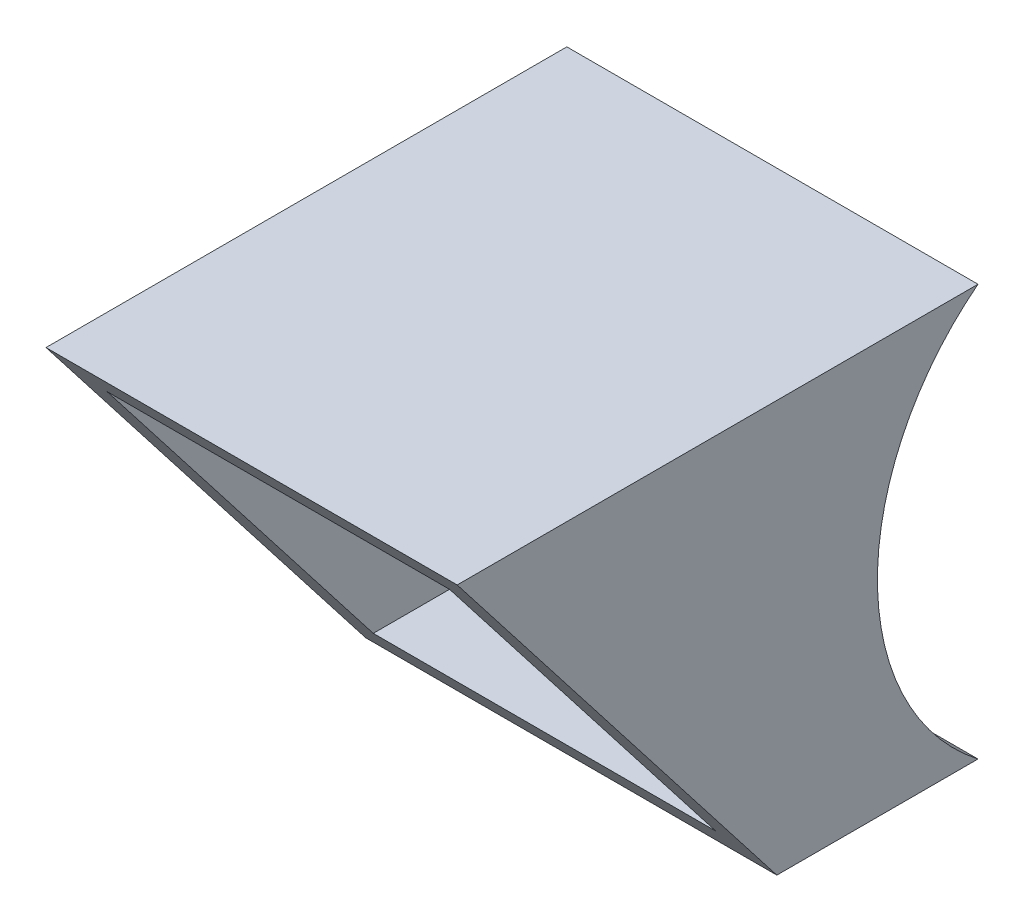
ISO-10303-21;
HEADER;
FILE_DESCRIPTION(('STEP AP214'),'2;1');
FILE_NAME('part.step','',(''),(''),'','','');
FILE_SCHEMA(('AUTOMOTIVE_DESIGN { 1 0 10303 214 1 1 1 1 }'));
ENDSEC;
DATA;
#1=APPLICATION_CONTEXT('core data for automotive mechanical design processes');
#2=APPLICATION_PROTOCOL_DEFINITION('international standard','automotive_design',2000,#1);
#3=PRODUCT_CONTEXT('',#1,'mechanical');
#4=PRODUCT('Part','Part','',(#3));
#5=PRODUCT_RELATED_PRODUCT_CATEGORY('part','',(#4));
#6=PRODUCT_DEFINITION_FORMATION('','',#4);
#7=PRODUCT_DEFINITION_CONTEXT('part definition',#1,'design');
#8=PRODUCT_DEFINITION('design','',#6,#7);
#9=PRODUCT_DEFINITION_SHAPE('','',#8);
#10=(LENGTH_UNIT() NAMED_UNIT(*) SI_UNIT(.MILLI.,.METRE.));
#11=(NAMED_UNIT(*) PLANE_ANGLE_UNIT() SI_UNIT($,.RADIAN.));
#12=(NAMED_UNIT(*) SI_UNIT($,.STERADIAN.) SOLID_ANGLE_UNIT());
#13=UNCERTAINTY_MEASURE_WITH_UNIT(LENGTH_MEASURE(1.E-05),#10,'distance_accuracy_value','');
#14=(GEOMETRIC_REPRESENTATION_CONTEXT(3) GLOBAL_UNCERTAINTY_ASSIGNED_CONTEXT((#13)) GLOBAL_UNIT_ASSIGNED_CONTEXT((#10,
#11,#12)) REPRESENTATION_CONTEXT('',''));
#15=CARTESIAN_POINT('',(0.,0.,0.));
#16=DIRECTION('',(0.,0.,1.));
#17=DIRECTION('',(1.,0.,0.));
#18=AXIS2_PLACEMENT_3D('',#15,#16,#17);
#19=CARTESIAN_POINT('',(38.1,19.05,-63.0706178129071));
#20=DIRECTION('',(-1.,0.,0.));
#21=DIRECTION('',(0.,0.,1.));
#22=AXIS2_PLACEMENT_3D('',#19,#20,#21);
#23=CYLINDRICAL_SURFACE('',#22,24.13);
#24=DIRECTION('',(-1.,0.,0.));
#25=VECTOR('',#24,1.);
#26=CARTESIAN_POINT('',(38.1,34.925,-44.8980760259143));
#27=LINE('',#26,#25);
#28=CARTESIAN_POINT('',(3.175,34.925,-44.8980760259143));
#29=VERTEX_POINT('',#28);
#30=CARTESIAN_POINT('',(34.925,34.925,-44.8980760259143));
#31=VERTEX_POINT('',#30);
#32=EDGE_CURVE('E106',#29,#31,#27,.F.);
#33=ORIENTED_EDGE('',*,*,#32,.F.);
#34=CARTESIAN_POINT('',(3.175,19.05,-63.0706178129071));
#35=DIRECTION('',(-1.,0.,0.));
#36=DIRECTION('',(0.,0.,1.));
#37=AXIS2_PLACEMENT_3D('',#34,#35,#36);
#38=CIRCLE('',#37,24.13);
#39=CARTESIAN_POINT('',(3.175,3.17500000000001,-44.8980760259143));
#40=VERTEX_POINT('',#39);
#41=EDGE_CURVE('E95',#40,#29,#38,.T.);
#42=ORIENTED_EDGE('',*,*,#41,.F.);
#43=DIRECTION('',(-1.,0.,0.));
#44=VECTOR('',#43,1.);
#45=CARTESIAN_POINT('',(38.1,3.17500000000001,-44.8980760259143));
#46=LINE('',#45,#44);
#47=CARTESIAN_POINT('',(34.925,3.175,-44.8980760259143));
#48=VERTEX_POINT('',#47);
#49=EDGE_CURVE('E100',#48,#40,#46,.T.);
#50=ORIENTED_EDGE('',*,*,#49,.F.);
#51=CARTESIAN_POINT('',(34.925,19.05,-63.0706178129071));
#52=DIRECTION('',(1.,0.,0.));
#53=DIRECTION('',(0.,0.,-1.));
#54=AXIS2_PLACEMENT_3D('',#51,#52,#53);
#55=CIRCLE('',#54,24.13);
#56=EDGE_CURVE('E112',#31,#48,#55,.T.);
#57=ORIENTED_EDGE('',*,*,#56,.F.);
#58=EDGE_LOOP('',(#33,#42,#50,#57));
#59=FACE_BOUND('',#58,.T.);
#60=CARTESIAN_POINT('',(0.,19.05,-63.0706178129071));
#61=DIRECTION('',(1.,0.,0.));
#62=DIRECTION('',(0.,0.,-1.));
#63=AXIS2_PLACEMENT_3D('',#60,#61,#62);
#64=CIRCLE('',#63,24.13);
#65=CARTESIAN_POINT('',(0.,38.1,-48.26));
#66=VERTEX_POINT('',#65);
#67=CARTESIAN_POINT('',(0.,0.,-48.26));
#68=VERTEX_POINT('',#67);
#69=EDGE_CURVE('E113',#66,#68,#64,.T.);
#70=ORIENTED_EDGE('',*,*,#69,.F.);
#71=DIRECTION('',(-1.,0.,0.));
#72=VECTOR('',#71,1.);
#73=CARTESIAN_POINT('',(38.1,38.1,-48.26));
#74=LINE('',#73,#72);
#75=CARTESIAN_POINT('',(38.1,38.1,-48.26));
#76=VERTEX_POINT('',#75);
#77=EDGE_CURVE('E145',#76,#66,#74,.T.);
#78=ORIENTED_EDGE('',*,*,#77,.F.);
#79=CARTESIAN_POINT('',(38.1,19.05,-63.0706178129071));
#80=DIRECTION('',(1.,0.,0.));
#81=DIRECTION('',(0.,0.,-1.));
#82=AXIS2_PLACEMENT_3D('',#79,#80,#81);
#83=CIRCLE('',#82,24.13);
#84=CARTESIAN_POINT('',(38.1,0.,-48.26));
#85=VERTEX_POINT('',#84);
#86=EDGE_CURVE('E121',#76,#85,#83,.T.);
#87=ORIENTED_EDGE('',*,*,#86,.T.);
#88=DIRECTION('',(-1.,0.,0.));
#89=VECTOR('',#88,1.);
#90=CARTESIAN_POINT('',(38.1,0.,-48.26));
#91=LINE('',#90,#89);
#92=EDGE_CURVE('E131',#85,#68,#91,.T.);
#93=ORIENTED_EDGE('',*,*,#92,.T.);
#94=EDGE_LOOP('',(#70,#78,#87,#93));
#95=FACE_BOUND('',#94,.T.);
#96=ADVANCED_FACE('F34',(#59,#95),#23,.F.);
#97=CARTESIAN_POINT('',(38.1,38.1,0.));
#98=DIRECTION('',(0.,1.,0.));
#99=DIRECTION('',(0.,0.,1.));
#100=AXIS2_PLACEMENT_3D('',#97,#98,#99);
#101=PLANE('',#100);
#102=DIRECTION('',(0.,0.,-1.));
#103=VECTOR('',#102,1.);
#104=CARTESIAN_POINT('',(0.,38.1,0.));
#105=LINE('',#104,#103);
#106=CARTESIAN_POINT('',(0.,38.1,0.));
#107=VERTEX_POINT('',#106);
#108=EDGE_CURVE('E116',#107,#66,#105,.T.);
#109=ORIENTED_EDGE('',*,*,#108,.F.);
#110=DIRECTION('',(-1.,0.,0.));
#111=VECTOR('',#110,1.);
#112=CARTESIAN_POINT('',(38.1,38.1,0.));
#113=LINE('',#112,#111);
#114=CARTESIAN_POINT('',(38.1,38.1,0.));
#115=VERTEX_POINT('',#114);
#116=EDGE_CURVE('E143',#115,#107,#113,.T.);
#117=ORIENTED_EDGE('',*,*,#116,.F.);
#118=DIRECTION('',(0.,0.,-1.));
#119=VECTOR('',#118,1.);
#120=CARTESIAN_POINT('',(38.1,38.1,0.));
#121=LINE('',#120,#119);
#122=EDGE_CURVE('E124',#115,#76,#121,.T.);
#123=ORIENTED_EDGE('',*,*,#122,.T.);
#124=ORIENTED_EDGE('',*,*,#77,.T.);
#125=EDGE_LOOP('',(#109,#117,#123,#124));
#126=FACE_BOUND('',#125,.T.);
#127=ADVANCED_FACE('F174',(#126),#101,.T.);
#128=CARTESIAN_POINT('',(38.1,14.3534626038781,-18.4619889634576));
#129=DIRECTION('',(0.,0.613784409983716,-0.789473684210526));
#130=DIRECTION('',(0.,0.789473684210526,0.613784409983716));
#131=AXIS2_PLACEMENT_3D('',#128,#129,#130);
#132=PLANE('',#131);
#133=DIRECTION('',(0.,0.789473684210527,0.613784409983716));
#134=VECTOR('',#133,1.);
#135=CARTESIAN_POINT('',(3.175,14.3534626038781,-18.4619889634576));
#136=LINE('',#135,#134);
#137=CARTESIAN_POINT('',(3.175,3.175,-27.152799323663));
#138=VERTEX_POINT('',#137);
#139=CARTESIAN_POINT('',(3.175,34.925,-2.46843630215118));
#140=VERTEX_POINT('',#139);
#141=EDGE_CURVE('E147',#138,#140,#136,.T.);
#142=ORIENTED_EDGE('',*,*,#141,.T.);
#143=DIRECTION('',(1.,0.,0.));
#144=VECTOR('',#143,1.);
#145=CARTESIAN_POINT('',(38.1,34.925,-2.46843630215118));
#146=LINE('',#145,#144);
#147=CARTESIAN_POINT('',(34.925,34.925,-2.46843630215118));
#148=VERTEX_POINT('',#147);
#149=EDGE_CURVE('E11',#140,#148,#146,.T.);
#150=ORIENTED_EDGE('',*,*,#149,.T.);
#151=DIRECTION('',(0.,-0.789473684210527,-0.613784409983716));
#152=VECTOR('',#151,1.);
#153=CARTESIAN_POINT('',(34.925,14.3534626038781,-18.4619889634576));
#154=LINE('',#153,#152);
#155=CARTESIAN_POINT('',(34.925,3.175,-27.152799323663));
#156=VERTEX_POINT('',#155);
#157=EDGE_CURVE('E41',#148,#156,#154,.T.);
#158=ORIENTED_EDGE('',*,*,#157,.T.);
#159=DIRECTION('',(-1.,0.,0.));
#160=VECTOR('',#159,1.);
#161=CARTESIAN_POINT('',(38.1,3.175,-27.1527993236629));
#162=LINE('',#161,#160);
#163=EDGE_CURVE('E149',#156,#138,#162,.T.);
#164=ORIENTED_EDGE('',*,*,#163,.T.);
#165=EDGE_LOOP('',(#142,#150,#158,#164));
#166=FACE_BOUND('',#165,.T.);
#167=DIRECTION('',(0.,-0.789473684210526,-0.613784409983716));
#168=VECTOR('',#167,1.);
#169=CARTESIAN_POINT('',(0.,14.3534626038781,-18.4619889634576));
#170=LINE('',#169,#168);
#171=CARTESIAN_POINT('',(0.,0.,-29.6212356258141));
#172=VERTEX_POINT('',#171);
#173=EDGE_CURVE('E135',#107,#172,#170,.T.);
#174=ORIENTED_EDGE('',*,*,#173,.T.);
#175=DIRECTION('',(-1.,0.,0.));
#176=VECTOR('',#175,1.);
#177=CARTESIAN_POINT('',(38.1,0.,-29.6212356258141));
#178=LINE('',#177,#176);
#179=CARTESIAN_POINT('',(38.1,0.,-29.6212356258141));
#180=VERTEX_POINT('',#179);
#181=EDGE_CURVE('E140',#180,#172,#178,.T.);
#182=ORIENTED_EDGE('',*,*,#181,.F.);
#183=DIRECTION('',(0.,-0.789473684210526,-0.613784409983716));
#184=VECTOR('',#183,1.);
#185=CARTESIAN_POINT('',(38.1,14.3534626038781,-18.4619889634576));
#186=LINE('',#185,#184);
#187=EDGE_CURVE('E128',#115,#180,#186,.T.);
#188=ORIENTED_EDGE('',*,*,#187,.F.);
#189=ORIENTED_EDGE('',*,*,#116,.T.);
#190=EDGE_LOOP('',(#174,#182,#188,#189));
#191=FACE_BOUND('',#190,.T.);
#192=ADVANCED_FACE('F153',(#166,#191),#132,.F.);
#193=CARTESIAN_POINT('',(38.1,0.,0.));
#194=DIRECTION('',(0.,1.,0.));
#195=DIRECTION('',(0.,0.,1.));
#196=AXIS2_PLACEMENT_3D('',#193,#194,#195);
#197=PLANE('',#196);
#198=DIRECTION('',(0.,0.,-1.));
#199=VECTOR('',#198,1.);
#200=CARTESIAN_POINT('',(0.,0.,0.));
#201=LINE('',#200,#199);
#202=EDGE_CURVE('E125',#172,#68,#201,.T.);
#203=ORIENTED_EDGE('',*,*,#202,.T.);
#204=ORIENTED_EDGE('',*,*,#92,.F.);
#205=DIRECTION('',(0.,0.,-1.));
#206=VECTOR('',#205,1.);
#207=CARTESIAN_POINT('',(38.1,0.,0.));
#208=LINE('',#207,#206);
#209=EDGE_CURVE('E130',#180,#85,#208,.T.);
#210=ORIENTED_EDGE('',*,*,#209,.F.);
#211=ORIENTED_EDGE('',*,*,#181,.T.);
#212=EDGE_LOOP('',(#203,#204,#210,#211));
#213=FACE_BOUND('',#212,.T.);
#214=ADVANCED_FACE('F182',(#213),#197,.F.);
#215=CARTESIAN_POINT('',(38.1,0.,0.));
#216=DIRECTION('',(1.,0.,0.));
#217=DIRECTION('',(0.,0.,-1.));
#218=AXIS2_PLACEMENT_3D('',#215,#216,#217);
#219=PLANE('',#218);
#220=ORIENTED_EDGE('',*,*,#86,.F.);
#221=ORIENTED_EDGE('',*,*,#122,.F.);
#222=ORIENTED_EDGE('',*,*,#187,.T.);
#223=ORIENTED_EDGE('',*,*,#209,.T.);
#224=EDGE_LOOP('',(#220,#221,#222,#223));
#225=FACE_BOUND('',#224,.T.);
#226=ADVANCED_FACE('F188',(#225),#219,.T.);
#227=CARTESIAN_POINT('',(0.,0.,0.));
#228=DIRECTION('',(1.,0.,0.));
#229=DIRECTION('',(0.,0.,-1.));
#230=AXIS2_PLACEMENT_3D('',#227,#228,#229);
#231=PLANE('',#230);
#232=ORIENTED_EDGE('',*,*,#69,.T.);
#233=ORIENTED_EDGE('',*,*,#202,.F.);
#234=ORIENTED_EDGE('',*,*,#173,.F.);
#235=ORIENTED_EDGE('',*,*,#108,.T.);
#236=EDGE_LOOP('',(#232,#233,#234,#235));
#237=FACE_BOUND('',#236,.T.);
#238=ADVANCED_FACE('F190',(#237),#231,.F.);
#239=CARTESIAN_POINT('',(34.925,34.925,-48.26));
#240=DIRECTION('',(0.,1.,0.));
#241=DIRECTION('',(0.,0.,1.));
#242=AXIS2_PLACEMENT_3D('',#239,#240,#241);
#243=PLANE('',#242);
#244=ORIENTED_EDGE('',*,*,#32,.T.);
#245=DIRECTION('',(0.,0.,1.));
#246=VECTOR('',#245,1.);
#247=CARTESIAN_POINT('',(34.925,34.925,-48.26));
#248=LINE('',#247,#246);
#249=EDGE_CURVE('E101',#31,#148,#248,.T.);
#250=ORIENTED_EDGE('',*,*,#249,.T.);
#251=ORIENTED_EDGE('',*,*,#149,.F.);
#252=DIRECTION('',(0.,0.,1.));
#253=VECTOR('',#252,1.);
#254=CARTESIAN_POINT('',(3.175,34.925,-48.26));
#255=LINE('',#254,#253);
#256=EDGE_CURVE('E53',#29,#140,#255,.T.);
#257=ORIENTED_EDGE('',*,*,#256,.F.);
#258=EDGE_LOOP('',(#244,#250,#251,#257));
#259=FACE_BOUND('',#258,.T.);
#260=ADVANCED_FACE('F104',(#259),#243,.F.);
#261=CARTESIAN_POINT('',(34.925,3.175,-48.26));
#262=DIRECTION('',(1.,0.,0.));
#263=DIRECTION('',(0.,0.,-1.));
#264=AXIS2_PLACEMENT_3D('',#261,#262,#263);
#265=PLANE('',#264);
#266=ORIENTED_EDGE('',*,*,#56,.T.);
#267=DIRECTION('',(0.,0.,1.));
#268=VECTOR('',#267,1.);
#269=CARTESIAN_POINT('',(34.925,3.175,-48.26));
#270=LINE('',#269,#268);
#271=EDGE_CURVE('E159',#48,#156,#270,.T.);
#272=ORIENTED_EDGE('',*,*,#271,.T.);
#273=ORIENTED_EDGE('',*,*,#157,.F.);
#274=ORIENTED_EDGE('',*,*,#249,.F.);
#275=EDGE_LOOP('',(#266,#272,#273,#274));
#276=FACE_BOUND('',#275,.T.);
#277=ADVANCED_FACE('F157',(#276),#265,.F.);
#278=CARTESIAN_POINT('',(3.175,3.175,-48.26));
#279=DIRECTION('',(0.,-1.,0.));
#280=DIRECTION('',(0.,0.,-1.));
#281=AXIS2_PLACEMENT_3D('',#278,#279,#280);
#282=PLANE('',#281);
#283=ORIENTED_EDGE('',*,*,#49,.T.);
#284=DIRECTION('',(0.,0.,1.));
#285=VECTOR('',#284,1.);
#286=CARTESIAN_POINT('',(3.175,3.175,-48.26));
#287=LINE('',#286,#285);
#288=EDGE_CURVE('E48',#40,#138,#287,.T.);
#289=ORIENTED_EDGE('',*,*,#288,.T.);
#290=ORIENTED_EDGE('',*,*,#163,.F.);
#291=ORIENTED_EDGE('',*,*,#271,.F.);
#292=EDGE_LOOP('',(#283,#289,#290,#291));
#293=FACE_BOUND('',#292,.T.);
#294=ADVANCED_FACE('F164',(#293),#282,.F.);
#295=CARTESIAN_POINT('',(3.175,34.925,-48.26));
#296=DIRECTION('',(-1.,0.,0.));
#297=DIRECTION('',(0.,0.,1.));
#298=AXIS2_PLACEMENT_3D('',#295,#296,#297);
#299=PLANE('',#298);
#300=ORIENTED_EDGE('',*,*,#41,.T.);
#301=ORIENTED_EDGE('',*,*,#256,.T.);
#302=ORIENTED_EDGE('',*,*,#141,.F.);
#303=ORIENTED_EDGE('',*,*,#288,.F.);
#304=EDGE_LOOP('',(#300,#301,#302,#303));
#305=FACE_BOUND('',#304,.T.);
#306=ADVANCED_FACE('F96',(#305),#299,.F.);
#307=CLOSED_SHELL('',(#96,#127,#192,#214,#226,#238,#260,#277,#294,#306));
#308=MANIFOLD_SOLID_BREP('B2',#307);
#309=ADVANCED_BREP_SHAPE_REPRESENTATION('',(#18,#308),#14);
#310=SHAPE_DEFINITION_REPRESENTATION(#9,#309);
ENDSEC;
END-ISO-10303-21;
